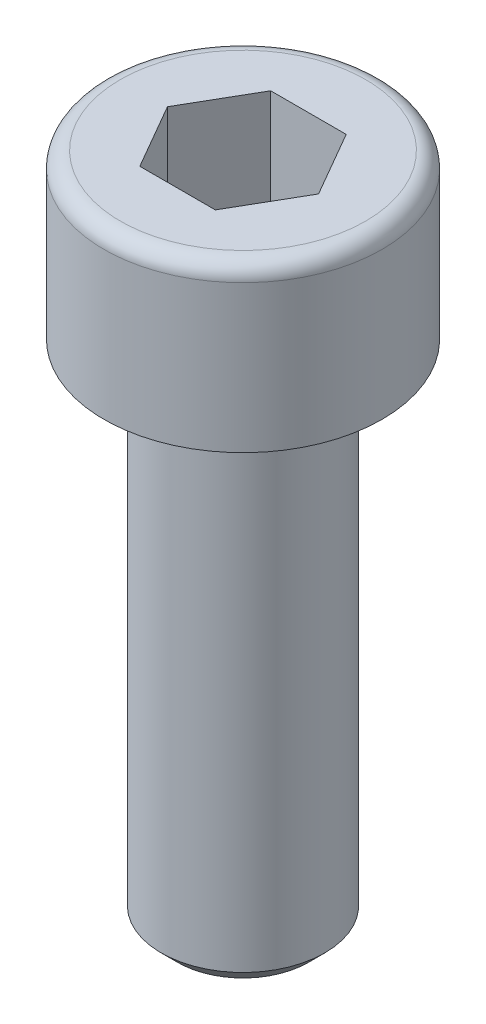
ISO-10303-21;
HEADER;
FILE_DESCRIPTION(('STEP AP214'),'2;1');
FILE_NAME('part.step','',(''),(''),'','','');
FILE_SCHEMA(('AUTOMOTIVE_DESIGN { 1 0 10303 214 1 1 1 1 }'));
ENDSEC;
DATA;
#1=APPLICATION_CONTEXT('core data for automotive mechanical design processes');
#2=APPLICATION_PROTOCOL_DEFINITION('international standard','automotive_design',2000,#1);
#3=PRODUCT_CONTEXT('',#1,'mechanical');
#4=PRODUCT('Part','Part','',(#3));
#5=PRODUCT_RELATED_PRODUCT_CATEGORY('part','',(#4));
#6=PRODUCT_DEFINITION_FORMATION('','',#4);
#7=PRODUCT_DEFINITION_CONTEXT('part definition',#1,'design');
#8=PRODUCT_DEFINITION('design','',#6,#7);
#9=PRODUCT_DEFINITION_SHAPE('','',#8);
#10=(LENGTH_UNIT() NAMED_UNIT(*) SI_UNIT(.MILLI.,.METRE.));
#11=(NAMED_UNIT(*) PLANE_ANGLE_UNIT() SI_UNIT($,.RADIAN.));
#12=(NAMED_UNIT(*) SI_UNIT($,.STERADIAN.) SOLID_ANGLE_UNIT());
#13=UNCERTAINTY_MEASURE_WITH_UNIT(LENGTH_MEASURE(1.E-05),#10,'distance_accuracy_value','');
#14=(GEOMETRIC_REPRESENTATION_CONTEXT(3) GLOBAL_UNCERTAINTY_ASSIGNED_CONTEXT((#13)) GLOBAL_UNIT_ASSIGNED_CONTEXT((#10,
#11,#12)) REPRESENTATION_CONTEXT('',''));
#15=CARTESIAN_POINT('',(0.,0.,0.));
#16=DIRECTION('',(0.,0.,1.));
#17=DIRECTION('',(1.,0.,0.));
#18=AXIS2_PLACEMENT_3D('',#15,#16,#17);
#19=CARTESIAN_POINT('',(0.,0.,0.));
#20=DIRECTION('',(0.,-1.,0.));
#21=DIRECTION('',(1.,0.,0.));
#22=AXIS2_PLACEMENT_3D('',#19,#20,#21);
#23=PLANE('',#22);
#24=CARTESIAN_POINT('',(0.,0.,0.));
#25=DIRECTION('',(0.,-1.,0.));
#26=DIRECTION('',(1.,0.,0.));
#27=AXIS2_PLACEMENT_3D('',#24,#25,#26);
#28=CIRCLE('',#27,1.99999999999996);
#29=CARTESIAN_POINT('',(1.99999999999996,0.,0.));
#30=VERTEX_POINT('',#29);
#31=EDGE_CURVE('E47',#30,#30,#28,.T.);
#32=ORIENTED_EDGE('',*,*,#31,.T.);
#33=EDGE_LOOP('',(#32));
#34=FACE_BOUND('',#33,.T.);
#35=ADVANCED_FACE('F38',(#34),#23,.T.);
#36=CARTESIAN_POINT('',(5.79765278016442E-13,-169.015508263326,0.));
#37=DIRECTION('',(0.,-1.,0.));
#38=DIRECTION('',(1.,0.,0.));
#39=AXIS2_PLACEMENT_3D('',#36,#37,#38);
#40=CYLINDRICAL_SURFACE('',#39,2.50000000000002);
#41=CARTESIAN_POINT('',(0.,0.500000000000056,0.));
#42=DIRECTION('',(0.,-1.,0.));
#43=DIRECTION('',(1.,0.,0.));
#44=AXIS2_PLACEMENT_3D('',#41,#42,#43);
#45=CIRCLE('',#44,2.50000000000002);
#46=CARTESIAN_POINT('',(2.50000000000002,0.500000000000065,0.));
#47=VERTEX_POINT('',#46);
#48=EDGE_CURVE('E11',#47,#47,#45,.F.);
#49=ORIENTED_EDGE('',*,*,#48,.T.);
#50=EDGE_LOOP('',(#49));
#51=FACE_BOUND('',#50,.T.);
#52=CARTESIAN_POINT('',(0.,15.,0.));
#53=DIRECTION('',(0.,-1.,0.));
#54=DIRECTION('',(1.,0.,0.));
#55=AXIS2_PLACEMENT_3D('',#52,#53,#54);
#56=CIRCLE('',#55,2.50000000000005);
#57=CARTESIAN_POINT('',(2.5,15.,0.));
#58=VERTEX_POINT('',#57);
#59=EDGE_CURVE('E158',#58,#58,#56,.T.);
#60=ORIENTED_EDGE('',*,*,#59,.T.);
#61=EDGE_LOOP('',(#60));
#62=FACE_BOUND('',#61,.T.);
#63=ADVANCED_FACE('F179',(#51,#62),#40,.T.);
#64=CARTESIAN_POINT('',(0.,15.,0.));
#65=DIRECTION('',(0.,-1.,0.));
#66=DIRECTION('',(1.,0.,0.));
#67=AXIS2_PLACEMENT_3D('',#64,#65,#66);
#68=TOROIDAL_SURFACE('',#67,3.00000000000005,0.5);
#69=CARTESIAN_POINT('',(0.,15.5,0.));
#70=DIRECTION('',(0.,-1.,0.));
#71=DIRECTION('',(1.,0.,0.));
#72=AXIS2_PLACEMENT_3D('',#69,#70,#71);
#73=CIRCLE('',#72,3.00000000000006);
#74=CARTESIAN_POINT('',(3.,15.5,0.));
#75=VERTEX_POINT('',#74);
#76=EDGE_CURVE('E155',#75,#75,#73,.T.);
#77=ORIENTED_EDGE('',*,*,#76,.T.);
#78=EDGE_LOOP('',(#77));
#79=FACE_BOUND('',#78,.T.);
#80=ORIENTED_EDGE('',*,*,#59,.F.);
#81=EDGE_LOOP('',(#80));
#82=FACE_BOUND('',#81,.T.);
#83=ADVANCED_FACE('F183',(#79,#82),#68,.F.);
#84=CARTESIAN_POINT('',(3.,15.5,0.));
#85=DIRECTION('',(0.,-1.,0.));
#86=DIRECTION('',(1.,0.,0.));
#87=AXIS2_PLACEMENT_3D('',#84,#85,#86);
#88=PLANE('',#87);
#89=CARTESIAN_POINT('',(0.,15.5,0.));
#90=DIRECTION('',(0.,-1.,0.));
#91=DIRECTION('',(1.,0.,0.));
#92=AXIS2_PLACEMENT_3D('',#89,#90,#91);
#93=CIRCLE('',#92,4.25000000000005);
#94=CARTESIAN_POINT('',(4.25,15.5,0.));
#95=VERTEX_POINT('',#94);
#96=EDGE_CURVE('E152',#95,#95,#93,.T.);
#97=ORIENTED_EDGE('',*,*,#96,.T.);
#98=EDGE_LOOP('',(#97));
#99=FACE_BOUND('',#98,.T.);
#100=ORIENTED_EDGE('',*,*,#76,.F.);
#101=EDGE_LOOP('',(#100));
#102=FACE_BOUND('',#101,.T.);
#103=ADVANCED_FACE('F189',(#99,#102),#88,.T.);
#104=CARTESIAN_POINT('',(5.79765278016442E-13,-169.015508263326,0.));
#105=DIRECTION('',(0.,-1.,0.));
#106=DIRECTION('',(1.,0.,0.));
#107=AXIS2_PLACEMENT_3D('',#104,#105,#106);
#108=CYLINDRICAL_SURFACE('',#107,4.25000000000006);
#109=CARTESIAN_POINT('',(0.,20.,0.));
#110=DIRECTION('',(0.,-1.,0.));
#111=DIRECTION('',(1.,0.,0.));
#112=AXIS2_PLACEMENT_3D('',#109,#110,#111);
#113=CIRCLE('',#112,4.25000000000007);
#114=CARTESIAN_POINT('',(4.25,20.,0.));
#115=VERTEX_POINT('',#114);
#116=EDGE_CURVE('E149',#115,#115,#113,.T.);
#117=ORIENTED_EDGE('',*,*,#116,.T.);
#118=EDGE_LOOP('',(#117));
#119=FACE_BOUND('',#118,.T.);
#120=ORIENTED_EDGE('',*,*,#96,.F.);
#121=EDGE_LOOP('',(#120));
#122=FACE_BOUND('',#121,.T.);
#123=ADVANCED_FACE('F193',(#119,#122),#108,.T.);
#124=CARTESIAN_POINT('',(0.,20.,0.));
#125=DIRECTION('',(0.,-1.,0.));
#126=DIRECTION('',(1.,0.,0.));
#127=AXIS2_PLACEMENT_3D('',#124,#125,#126);
#128=TOROIDAL_SURFACE('',#127,3.75000000000007,0.5);
#129=CARTESIAN_POINT('',(0.,20.5,0.));
#130=DIRECTION('',(0.,-1.,0.));
#131=DIRECTION('',(1.,0.,0.));
#132=AXIS2_PLACEMENT_3D('',#129,#130,#131);
#133=CIRCLE('',#132,3.75000000000007);
#134=CARTESIAN_POINT('',(3.75,20.5,0.));
#135=VERTEX_POINT('',#134);
#136=EDGE_CURVE('E141',#135,#135,#133,.T.);
#137=ORIENTED_EDGE('',*,*,#136,.T.);
#138=EDGE_LOOP('',(#137));
#139=FACE_BOUND('',#138,.T.);
#140=ORIENTED_EDGE('',*,*,#116,.F.);
#141=EDGE_LOOP('',(#140));
#142=FACE_BOUND('',#141,.T.);
#143=ADVANCED_FACE('F174',(#139,#142),#128,.T.);
#144=CARTESIAN_POINT('',(3.75,20.5,0.));
#145=DIRECTION('',(0.,1.,0.));
#146=DIRECTION('',(-1.,0.,0.));
#147=AXIS2_PLACEMENT_3D('',#144,#145,#146);
#148=PLANE('',#147);
#149=DIRECTION('',(0.5,0.,-0.866025403784439));
#150=VECTOR('',#149,1.);
#151=CARTESIAN_POINT('',(1.15470053837918,20.5,2.));
#152=LINE('',#151,#150);
#153=CARTESIAN_POINT('',(1.15470053837918,20.5,2.));
#154=VERTEX_POINT('',#153);
#155=CARTESIAN_POINT('',(2.30940107675843,20.5,0.));
#156=VERTEX_POINT('',#155);
#157=EDGE_CURVE('E54',#154,#156,#152,.T.);
#158=ORIENTED_EDGE('',*,*,#157,.F.);
#159=DIRECTION('',(1.,0.,0.));
#160=VECTOR('',#159,1.);
#161=CARTESIAN_POINT('',(-1.15470053837932,20.5,2.));
#162=LINE('',#161,#160);
#163=CARTESIAN_POINT('',(-1.15470053837932,20.5,2.));
#164=VERTEX_POINT('',#163);
#165=EDGE_CURVE('E137',#164,#154,#162,.T.);
#166=ORIENTED_EDGE('',*,*,#165,.F.);
#167=DIRECTION('',(0.5,0.,0.866025403784439));
#168=VECTOR('',#167,1.);
#169=CARTESIAN_POINT('',(-2.30940107675857,20.5,0.));
#170=LINE('',#169,#168);
#171=CARTESIAN_POINT('',(-2.30940107675857,20.5,0.));
#172=VERTEX_POINT('',#171);
#173=EDGE_CURVE('E135',#172,#164,#170,.T.);
#174=ORIENTED_EDGE('',*,*,#173,.F.);
#175=DIRECTION('',(-0.5,0.,0.866025403784439));
#176=VECTOR('',#175,1.);
#177=CARTESIAN_POINT('',(-1.15470053837932,20.5,-2.));
#178=LINE('',#177,#176);
#179=CARTESIAN_POINT('',(-1.15470053837932,20.5,-2.));
#180=VERTEX_POINT('',#179);
#181=EDGE_CURVE('E102',#180,#172,#178,.T.);
#182=ORIENTED_EDGE('',*,*,#181,.F.);
#183=DIRECTION('',(-1.,0.,0.));
#184=VECTOR('',#183,1.);
#185=CARTESIAN_POINT('',(1.15470053837918,20.5,-2.));
#186=LINE('',#185,#184);
#187=CARTESIAN_POINT('',(1.15470053837918,20.5,-2.));
#188=VERTEX_POINT('',#187);
#189=EDGE_CURVE('E131',#188,#180,#186,.T.);
#190=ORIENTED_EDGE('',*,*,#189,.F.);
#191=DIRECTION('',(-0.5,0.,-0.866025403784438));
#192=VECTOR('',#191,1.);
#193=CARTESIAN_POINT('',(2.30940107675843,20.5,0.));
#194=LINE('',#193,#192);
#195=EDGE_CURVE('E128',#156,#188,#194,.T.);
#196=ORIENTED_EDGE('',*,*,#195,.F.);
#197=EDGE_LOOP('',(#158,#166,#174,#182,#190,#196));
#198=FACE_BOUND('',#197,.T.);
#199=ORIENTED_EDGE('',*,*,#136,.F.);
#200=EDGE_LOOP('',(#199));
#201=FACE_BOUND('',#200,.T.);
#202=ADVANCED_FACE('F166',(#198,#201),#148,.T.);
#203=CARTESIAN_POINT('',(0.,0.,0.));
#204=DIRECTION('',(0.,1.,0.));
#205=DIRECTION('',(-1.,0.,0.));
#206=AXIS2_PLACEMENT_3D('',#203,#204,#205);
#207=CONICAL_SURFACE('',#206,1.99999999999996,0.785398163397447);
#208=ORIENTED_EDGE('',*,*,#48,.F.);
#209=EDGE_LOOP('',(#208));
#210=FACE_BOUND('',#209,.T.);
#211=ORIENTED_EDGE('',*,*,#31,.F.);
#212=EDGE_LOOP('',(#211));
#213=FACE_BOUND('',#212,.T.);
#214=ADVANCED_FACE('F41',(#210,#213),#207,.T.);
#215=CARTESIAN_POINT('',(1.15470053837919,17.5,2.));
#216=DIRECTION('',(0.866025403784439,0.,0.5));
#217=DIRECTION('',(0.5,0.,-0.866025403784439));
#218=AXIS2_PLACEMENT_3D('',#215,#216,#217);
#219=PLANE('',#218);
#220=ORIENTED_EDGE('',*,*,#157,.T.);
#221=DIRECTION('',(0.,1.,0.));
#222=VECTOR('',#221,1.);
#223=CARTESIAN_POINT('',(2.30940107675844,17.5,0.));
#224=LINE('',#223,#222);
#225=CARTESIAN_POINT('',(2.30940107675844,17.5,0.));
#226=VERTEX_POINT('',#225);
#227=EDGE_CURVE('E84',#226,#156,#224,.T.);
#228=ORIENTED_EDGE('',*,*,#227,.F.);
#229=DIRECTION('',(0.5,0.,-0.866025403784439));
#230=VECTOR('',#229,1.);
#231=CARTESIAN_POINT('',(1.15470053837919,17.5,2.));
#232=LINE('',#231,#230);
#233=CARTESIAN_POINT('',(1.15470053837919,17.5,2.));
#234=VERTEX_POINT('',#233);
#235=EDGE_CURVE('E139',#234,#226,#232,.T.);
#236=ORIENTED_EDGE('',*,*,#235,.F.);
#237=DIRECTION('',(0.,1.,0.));
#238=VECTOR('',#237,1.);
#239=CARTESIAN_POINT('',(1.15470053837919,17.5,2.));
#240=LINE('',#239,#238);
#241=EDGE_CURVE('E62',#234,#154,#240,.T.);
#242=ORIENTED_EDGE('',*,*,#241,.T.);
#243=EDGE_LOOP('',(#220,#228,#236,#242));
#244=FACE_BOUND('',#243,.T.);
#245=ADVANCED_FACE('F165',(#244),#219,.F.);
#246=CARTESIAN_POINT('',(-1.15470053837931,17.5,2.));
#247=DIRECTION('',(0.,0.,1.));
#248=DIRECTION('',(1.,0.,0.));
#249=AXIS2_PLACEMENT_3D('',#246,#247,#248);
#250=PLANE('',#249);
#251=ORIENTED_EDGE('',*,*,#165,.T.);
#252=ORIENTED_EDGE('',*,*,#241,.F.);
#253=DIRECTION('',(1.,0.,0.));
#254=VECTOR('',#253,1.);
#255=CARTESIAN_POINT('',(-1.15470053837931,17.5,2.));
#256=LINE('',#255,#254);
#257=CARTESIAN_POINT('',(-1.15470053837931,17.5,2.));
#258=VERTEX_POINT('',#257);
#259=EDGE_CURVE('E114',#258,#234,#256,.T.);
#260=ORIENTED_EDGE('',*,*,#259,.F.);
#261=DIRECTION('',(0.,1.,0.));
#262=VECTOR('',#261,1.);
#263=CARTESIAN_POINT('',(-1.15470053837931,17.5,2.));
#264=LINE('',#263,#262);
#265=EDGE_CURVE('E106',#258,#164,#264,.T.);
#266=ORIENTED_EDGE('',*,*,#265,.T.);
#267=EDGE_LOOP('',(#251,#252,#260,#266));
#268=FACE_BOUND('',#267,.T.);
#269=ADVANCED_FACE('F172',(#268),#250,.F.);
#270=CARTESIAN_POINT('',(-2.30940107675856,17.5,0.));
#271=DIRECTION('',(-0.866025403784438,0.,0.5));
#272=DIRECTION('',(0.5,0.,0.866025403784439));
#273=AXIS2_PLACEMENT_3D('',#270,#271,#272);
#274=PLANE('',#273);
#275=ORIENTED_EDGE('',*,*,#173,.T.);
#276=ORIENTED_EDGE('',*,*,#265,.F.);
#277=DIRECTION('',(0.5,0.,0.866025403784439));
#278=VECTOR('',#277,1.);
#279=CARTESIAN_POINT('',(-2.30940107675856,17.5,0.));
#280=LINE('',#279,#278);
#281=CARTESIAN_POINT('',(-2.30940107675856,17.5,0.));
#282=VERTEX_POINT('',#281);
#283=EDGE_CURVE('E110',#282,#258,#280,.T.);
#284=ORIENTED_EDGE('',*,*,#283,.F.);
#285=DIRECTION('',(0.,1.,0.));
#286=VECTOR('',#285,1.);
#287=CARTESIAN_POINT('',(-2.30940107675856,17.5,0.));
#288=LINE('',#287,#286);
#289=EDGE_CURVE('E95',#282,#172,#288,.T.);
#290=ORIENTED_EDGE('',*,*,#289,.T.);
#291=EDGE_LOOP('',(#275,#276,#284,#290));
#292=FACE_BOUND('',#291,.T.);
#293=ADVANCED_FACE('F111',(#292),#274,.F.);
#294=CARTESIAN_POINT('',(-1.15470053837931,17.5,-2.));
#295=DIRECTION('',(-0.866025403784439,0.,-0.5));
#296=DIRECTION('',(-0.5,0.,0.866025403784439));
#297=AXIS2_PLACEMENT_3D('',#294,#295,#296);
#298=PLANE('',#297);
#299=ORIENTED_EDGE('',*,*,#181,.T.);
#300=ORIENTED_EDGE('',*,*,#289,.F.);
#301=DIRECTION('',(-0.5,0.,0.866025403784439));
#302=VECTOR('',#301,1.);
#303=CARTESIAN_POINT('',(-1.15470053837931,17.5,-2.));
#304=LINE('',#303,#302);
#305=CARTESIAN_POINT('',(-1.15470053837931,17.5,-2.));
#306=VERTEX_POINT('',#305);
#307=EDGE_CURVE('E99',#306,#282,#304,.T.);
#308=ORIENTED_EDGE('',*,*,#307,.F.);
#309=DIRECTION('',(0.,1.,0.));
#310=VECTOR('',#309,1.);
#311=CARTESIAN_POINT('',(-1.15470053837931,17.5,-2.));
#312=LINE('',#311,#310);
#313=EDGE_CURVE('E107',#306,#180,#312,.T.);
#314=ORIENTED_EDGE('',*,*,#313,.T.);
#315=EDGE_LOOP('',(#299,#300,#308,#314));
#316=FACE_BOUND('',#315,.T.);
#317=ADVANCED_FACE('F97',(#316),#298,.F.);
#318=CARTESIAN_POINT('',(1.15470053837919,17.5,-2.));
#319=DIRECTION('',(0.,0.,-1.));
#320=DIRECTION('',(-1.,0.,0.));
#321=AXIS2_PLACEMENT_3D('',#318,#319,#320);
#322=PLANE('',#321);
#323=ORIENTED_EDGE('',*,*,#189,.T.);
#324=ORIENTED_EDGE('',*,*,#313,.F.);
#325=DIRECTION('',(-1.,0.,0.));
#326=VECTOR('',#325,1.);
#327=CARTESIAN_POINT('',(1.15470053837919,17.5,-2.));
#328=LINE('',#327,#326);
#329=CARTESIAN_POINT('',(1.15470053837919,17.5,-2.));
#330=VERTEX_POINT('',#329);
#331=EDGE_CURVE('E120',#330,#306,#328,.T.);
#332=ORIENTED_EDGE('',*,*,#331,.F.);
#333=DIRECTION('',(0.,1.,0.));
#334=VECTOR('',#333,1.);
#335=CARTESIAN_POINT('',(1.15470053837919,17.5,-2.));
#336=LINE('',#335,#334);
#337=EDGE_CURVE('E144',#330,#188,#336,.T.);
#338=ORIENTED_EDGE('',*,*,#337,.T.);
#339=EDGE_LOOP('',(#323,#324,#332,#338));
#340=FACE_BOUND('',#339,.T.);
#341=ADVANCED_FACE('F204',(#340),#322,.F.);
#342=CARTESIAN_POINT('',(2.30940107675844,17.5,0.));
#343=DIRECTION('',(0.866025403784438,0.,-0.5));
#344=DIRECTION('',(-0.5,0.,-0.866025403784439));
#345=AXIS2_PLACEMENT_3D('',#342,#343,#344);
#346=PLANE('',#345);
#347=ORIENTED_EDGE('',*,*,#195,.T.);
#348=ORIENTED_EDGE('',*,*,#337,.F.);
#349=DIRECTION('',(-0.5,0.,-0.866025403784438));
#350=VECTOR('',#349,1.);
#351=CARTESIAN_POINT('',(2.30940107675844,17.5,0.));
#352=LINE('',#351,#350);
#353=EDGE_CURVE('E122',#226,#330,#352,.T.);
#354=ORIENTED_EDGE('',*,*,#353,.F.);
#355=ORIENTED_EDGE('',*,*,#227,.T.);
#356=EDGE_LOOP('',(#347,#348,#354,#355));
#357=FACE_BOUND('',#356,.T.);
#358=ADVANCED_FACE('F201',(#357),#346,.F.);
#359=CARTESIAN_POINT('',(0.,17.5,0.));
#360=DIRECTION('',(0.,1.,0.));
#361=DIRECTION('',(-1.,0.,0.));
#362=AXIS2_PLACEMENT_3D('',#359,#360,#361);
#363=PLANE('',#362);
#364=ORIENTED_EDGE('',*,*,#235,.T.);
#365=ORIENTED_EDGE('',*,*,#353,.T.);
#366=ORIENTED_EDGE('',*,*,#331,.T.);
#367=ORIENTED_EDGE('',*,*,#307,.T.);
#368=ORIENTED_EDGE('',*,*,#283,.T.);
#369=ORIENTED_EDGE('',*,*,#259,.T.);
#370=EDGE_LOOP('',(#364,#365,#366,#367,#368,#369));
#371=FACE_BOUND('',#370,.T.);
#372=ADVANCED_FACE('F117',(#371),#363,.T.);
#373=CLOSED_SHELL('',(#35,#63,#83,#103,#123,#143,#202,#214,#245,#269,#293,#317,#341,#358,#372));
#374=MANIFOLD_SOLID_BREP('B2',#373);
#375=ADVANCED_BREP_SHAPE_REPRESENTATION('',(#18,#374),#14);
#376=SHAPE_DEFINITION_REPRESENTATION(#9,#375);
ENDSEC;
END-ISO-10303-21;
